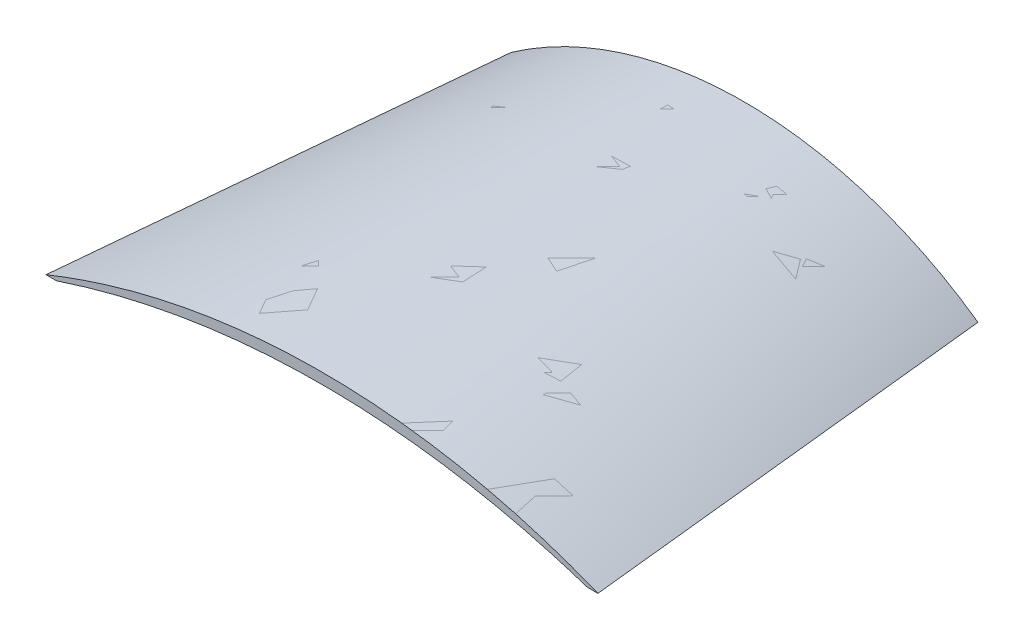
ISO-10303-21;
HEADER;
FILE_DESCRIPTION(('STEP AP214'),'2;1');
FILE_NAME('part.step','',(''),(''),'','','');
FILE_SCHEMA(('AUTOMOTIVE_DESIGN { 1 0 10303 214 1 1 1 1 }'));
ENDSEC;
DATA;
#1=APPLICATION_CONTEXT('core data for automotive mechanical design processes');
#2=APPLICATION_PROTOCOL_DEFINITION('international standard','automotive_design',2000,#1);
#3=PRODUCT_CONTEXT('',#1,'mechanical');
#4=PRODUCT('Part','Part','',(#3));
#5=PRODUCT_RELATED_PRODUCT_CATEGORY('part','',(#4));
#6=PRODUCT_DEFINITION_FORMATION('','',#4);
#7=PRODUCT_DEFINITION_CONTEXT('part definition',#1,'design');
#8=PRODUCT_DEFINITION('design','',#6,#7);
#9=PRODUCT_DEFINITION_SHAPE('','',#8);
#10=(LENGTH_UNIT() NAMED_UNIT(*) SI_UNIT(.MILLI.,.METRE.));
#11=(NAMED_UNIT(*) PLANE_ANGLE_UNIT() SI_UNIT($,.RADIAN.));
#12=(NAMED_UNIT(*) SI_UNIT($,.STERADIAN.) SOLID_ANGLE_UNIT());
#13=UNCERTAINTY_MEASURE_WITH_UNIT(LENGTH_MEASURE(1.E-05),#10,'distance_accuracy_value','');
#14=(GEOMETRIC_REPRESENTATION_CONTEXT(3) GLOBAL_UNCERTAINTY_ASSIGNED_CONTEXT((#13)) GLOBAL_UNIT_ASSIGNED_CONTEXT((#10,
#11,#12)) REPRESENTATION_CONTEXT('',''));
#15=CARTESIAN_POINT('',(0.,0.,0.));
#16=DIRECTION('',(0.,0.,1.));
#17=DIRECTION('',(1.,0.,0.));
#18=AXIS2_PLACEMENT_3D('',#15,#16,#17);
#19=CARTESIAN_POINT('',(48.689157452351,4.59007896781084,17.9937582420513));
#20=CARTESIAN_POINT('',(28.579999999884,13.7587850960682,17.9999999992136));
#21=CARTESIAN_POINT('',(48.5701563046397,4.59007896781084,17.9937582420513));
#22=CARTESIAN_POINT('',(28.579999999884,12.9331700401961,17.9999999992136));
#23=CARTESIAN_POINT('',(48.239008172471,4.59007896781085,17.9937582420513));
#24=CARTESIAN_POINT('',(28.579999999884,10.9313754692016,17.9999999992136));
#25=CARTESIAN_POINT('',(48.1202458578459,4.59007896781084,17.9937582420513));
#26=CARTESIAN_POINT('',(28.579999999884,8.48047323585448,17.9999999992136));
#27=CARTESIAN_POINT('',(47.210295202605,4.59007896781085,17.9937582420513));
#28=CARTESIAN_POINT('',(28.579999999884,6.87295938386817,17.9999999992136));
#29=CARTESIAN_POINT('',(47.5270718002623,4.59007896781085,17.9937582420513));
#30=CARTESIAN_POINT('',(28.579999999884,6.02886464909115,17.9999999992136));
#31=CARTESIAN_POINT('',(45.8512795127584,4.59788469502438,17.9940470368582));
#32=CARTESIAN_POINT('',(28.579999999884,5.27886464909115,17.9999999992136));
#33=CARTESIAN_POINT('',(43.9652838935692,4.6154547570032,17.9946970906608));
#34=CARTESIAN_POINT('',(28.579999999884,5.42063477681079,17.9999999992136));
#35=CARTESIAN_POINT('',(40.3735495091189,4.6489155959914,17.9959350684011));
#36=CARTESIAN_POINT('',(28.579999999884,5.01339566392776,17.9999999992136));
#37=CARTESIAN_POINT('',(34.8973977399996,4.69993179401957,17.9978225559673));
#38=CARTESIAN_POINT('',(28.579999999884,4.96024480418254,17.9999999992136));
#39=CARTESIAN_POINT('',(30.4247057116461,4.74159969364282,17.9993641769718));
#40=CARTESIAN_POINT('',(28.579999999884,4.81204284311955,17.9999999992136));
#41=CARTESIAN_POINT('',(28.579999999884,4.75878509606822,17.9999999992136));
#42=CARTESIAN_POINT('',(28.579999999884,4.75878509606822,17.9999999992136));
#43=B_SPLINE_SURFACE_WITH_KNOTS('',3,1,((#19,#20),(#21,#22),(#23,#24),(#25,#26),(#27,#28),(#29,
#30),(#31,#32),(#33,#34),(#35,#36),(#37,#38),(#39,#40),(#41,#42)),.UNSPECIFIED.,.F.,.F.,.F.,(4,
1,1,1,2,1,1,1,4),(2,2),(0.,0.125,0.25,0.375,0.5,0.625,0.75,0.875,1.),(0.,1.),.UNSPECIFIED.);
#44=CARTESIAN_POINT('',(48.689157452351,4.59007896781084,17.9937582420513));
#45=CARTESIAN_POINT('',(48.5701563046397,4.59007896781084,17.9937582420513));
#46=CARTESIAN_POINT('',(48.239008172471,4.59007896781085,17.9937582420513));
#47=CARTESIAN_POINT('',(48.1202458578459,4.59007896781084,17.9937582420513));
#48=CARTESIAN_POINT('',(47.210295202605,4.59007896781085,17.9937582420513));
#49=CARTESIAN_POINT('',(47.5270718002623,4.59007896781085,17.9937582420513));
#50=CARTESIAN_POINT('',(45.8512795127584,4.59788469502438,17.9940470368582));
#51=CARTESIAN_POINT('',(43.9652838935692,4.6154547570032,17.9946970906608));
#52=CARTESIAN_POINT('',(40.3735495091189,4.6489155959914,17.9959350684011));
#53=CARTESIAN_POINT('',(34.8973977399996,4.69993179401957,17.9978225559673));
#54=CARTESIAN_POINT('',(30.4247057116461,4.74159969364282,17.9993641769718));
#55=CARTESIAN_POINT('',(28.579999999884,4.75878509606822,17.9999999992136));
#56=B_SPLINE_CURVE_WITH_KNOTS('',3,(#44,#45,#46,#47,#48,#49,#50,#51,#52,#53,#54,#55),
.UNSPECIFIED.,.F.,.F.,(4,1,1,1,2,1,1,1,4),(0.,0.125,0.25,0.375,0.5,0.625,0.75,0.875,1.),.UNSPECIFIED.);
#57=CARTESIAN_POINT('',(48.689157452351,4.59007896781084,17.9937582420513));
#58=VERTEX_POINT('',#57);
#59=CARTESIAN_POINT('',(28.579999999884,4.75878509606822,17.9999999992136));
#60=VERTEX_POINT('',#59);
#61=EDGE_CURVE('E14',#58,#60,#56,.T.);
#62=DIRECTION('',(0.,1.,0.));
#63=VECTOR('',#62,1.);
#64=CARTESIAN_POINT('',(28.579999999884,5.65386464909115,17.9999999992136));
#65=LINE('',#64,#63);
#66=CARTESIAN_POINT('',(28.579999999884,13.7587850960682,17.9999999992136));
#67=VERTEX_POINT('',#66);
#68=EDGE_CURVE('E153',#60,#67,#65,.T.);
#69=DIRECTION('',(0.909885493207906,-0.414859385198377,-0.000282422787108244));
#70=VECTOR('',#69,1.);
#71=CARTESIAN_POINT('',(38.6345787261175,9.17443203193953,17.9968791206325));
#72=LINE('',#71,#70);
#73=EDGE_CURVE('E148',#67,#58,#72,.T.);
#74=ORIENTED_EDGE('',*,*,#61,.T.);
#75=ORIENTED_EDGE('',*,*,#68,.T.);
#76=ORIENTED_EDGE('',*,*,#73,.T.);
#77=EDGE_LOOP('',(#74,#75,#76));
#78=FACE_BOUND('',#77,.T.);
#79=ADVANCED_FACE('F145',(#78),#43,.T.);
#80=OPEN_SHELL('',(#79));
#81=SHELL_BASED_SURFACE_MODEL('B2',(#80));
#82=CARTESIAN_POINT('',(44.752828689061,3.97,4.86883118313408));
#83=CARTESIAN_POINT('',(45.3982716101576,4.17669298927028,9.24380686943982));
#84=CARTESIAN_POINT('',(46.0437145312543,4.38338597854056,13.6187825557456));
#85=CARTESIAN_POINT('',(46.689157452351,4.59007896781085,17.9937582420513));
#86=CARTESIAN_POINT('',(39.3618953557276,3.97,4.86883118313408));
#87=CARTESIAN_POINT('',(39.7921874487724,4.19543811463221,9.24450039801341));
#88=CARTESIAN_POINT('',(40.2224795418172,4.42087622926443,13.6201696128927));
#89=CARTESIAN_POINT('',(40.652771634862,4.64631434389664,17.9958388277721));
#90=CARTESIAN_POINT('',(33.9709620223943,3.97,4.86883118313408));
#91=CARTESIAN_POINT('',(34.1861032873872,4.21418323999414,9.245193926587));
#92=CARTESIAN_POINT('',(34.4012445523801,4.45836647998829,13.6215566700399));
#93=CARTESIAN_POINT('',(34.616385817373,4.70254971998243,17.9979194134928));
#94=CARTESIAN_POINT('',(28.580028689061,3.97,4.86883118313408));
#95=CARTESIAN_POINT('',(28.580019126002,4.23292836535607,9.24588745516059));
#96=CARTESIAN_POINT('',(28.580009562943,4.49585673071215,13.6229437271871));
#97=CARTESIAN_POINT('',(28.579999999884,4.75878509606822,17.9999999992136));
#98=B_SPLINE_SURFACE_WITH_KNOTS('',3,3,((#82,#83,#84,#85),(#86,#87,#88,#89),(#90,#91,#92,#93),
(#94,#95,#96,#97)),.UNSPECIFIED.,.F.,.F.,.F.,(4,4),(4,4),(0.,1.),(0.,1.),.UNSPECIFIED.);
#99=DIRECTION('',(-1.,0.,0.));
#100=VECTOR('',#99,1.);
#101=CARTESIAN_POINT('',(36.666428689061,3.97,4.86883118313408));
#102=LINE('',#101,#100);
#103=CARTESIAN_POINT('',(44.752828689061,3.97,4.86883118313408));
#104=VERTEX_POINT('',#103);
#105=CARTESIAN_POINT('',(28.580028689061,3.97,4.86883118313408));
#106=VERTEX_POINT('',#105);
#107=EDGE_CURVE('E143',#104,#106,#102,.T.);
#108=DIRECTION('',(-2.18088401127808E-06,0.0599615947437545,0.998200684807935));
#109=VECTOR('',#108,1.);
#110=CARTESIAN_POINT('',(28.5800143444725,4.36439254803411,11.4344155911738));
#111=LINE('',#110,#109);
#112=CARTESIAN_POINT('',(28.579999999884,4.75878509606822,17.9999999992136));
#113=VERTEX_POINT('',#112);
#114=EDGE_CURVE('E211',#106,#113,#111,.T.);
#115=DIRECTION('',(0.999956548877762,-0.00931566243374799,-0.000344659102298652));
#116=VECTOR('',#115,1.);
#117=CARTESIAN_POINT('',(37.6345787261175,4.67443203193953,17.9968791206324));
#118=LINE('',#117,#116);
#119=CARTESIAN_POINT('',(46.689157452351,4.59007896781085,17.9937582420513));
#120=VERTEX_POINT('',#119);
#121=EDGE_CURVE('E219',#113,#120,#118,.T.);
#122=DIRECTION('',(-0.145791696182336,-0.0466875079263572,-0.988213063022294));
#123=VECTOR('',#122,1.);
#124=CARTESIAN_POINT('',(45.720993070706,4.28003948390542,11.4312947125927));
#125=LINE('',#124,#123);
#126=EDGE_CURVE('E205',#120,#104,#125,.T.);
#127=ORIENTED_EDGE('',*,*,#107,.T.);
#128=ORIENTED_EDGE('',*,*,#114,.T.);
#129=ORIENTED_EDGE('',*,*,#121,.T.);
#130=ORIENTED_EDGE('',*,*,#126,.T.);
#131=EDGE_LOOP('',(#127,#128,#129,#130));
#132=FACE_BOUND('',#131,.T.);
#133=ADVANCED_FACE('F202',(#132),#98,.T.);
#134=OPEN_SHELL('',(#133));
#135=SHELL_BASED_SURFACE_MODEL('B8',(#134));
#136=CARTESIAN_POINT('',(28.580028689061,12.97,4.86883118313408));
#137=DIRECTION('',(0.,0.,1.));
#138=DIRECTION('',(0.,-1.,0.));
#139=AXIS2_PLACEMENT_3D('',#136,#137,#138);
#140=PLANE('',#139);
#141=DIRECTION('',(0.,-1.,0.));
#142=VECTOR('',#141,1.);
#143=CARTESIAN_POINT('',(28.580028689061,4.96049128367671,4.86883118313408));
#144=LINE('',#143,#142);
#145=CARTESIAN_POINT('',(28.580028689061,12.97,4.86883118313408));
#146=VERTEX_POINT('',#145);
#147=CARTESIAN_POINT('',(28.580028689061,3.97,4.86883118313408));
#148=VERTEX_POINT('',#147);
#149=EDGE_CURVE('E200',#146,#148,#144,.T.);
#150=ORIENTED_EDGE('',*,*,#149,.T.);
#151=DIRECTION('',(1.,0.,0.));
#152=VECTOR('',#151,1.);
#153=CARTESIAN_POINT('',(44.752828689061,3.97,4.86883118313408));
#154=LINE('',#153,#152);
#155=CARTESIAN_POINT('',(46.752828689061,3.97,4.86883118313408));
#156=VERTEX_POINT('',#155);
#157=EDGE_CURVE('E269',#148,#156,#154,.T.);
#158=ORIENTED_EDGE('',*,*,#157,.T.);
#159=DIRECTION('',(-0.896124896259063,0.443801949415146,0.));
#160=VECTOR('',#159,1.);
#161=CARTESIAN_POINT('',(37.666428689061,8.47,4.86883118313408));
#162=LINE('',#161,#160);
#163=EDGE_CURVE('E264',#156,#146,#162,.T.);
#164=ORIENTED_EDGE('',*,*,#163,.T.);
#165=EDGE_LOOP('',(#150,#158,#164));
#166=FACE_BOUND('',#165,.T.);
#167=ADVANCED_FACE('F263',(#166),#140,.T.);
#168=OPEN_SHELL('',(#167));
#169=SHELL_BASED_SURFACE_MODEL('B137',(#168));
#170=CARTESIAN_POINT('',(-42.8625,7.93999999999995,88.9));
#171=CARTESIAN_POINT('',(-41.6740571036464,6.61666666666663,60.889610394378));
#172=CARTESIAN_POINT('',(-40.4856142072927,5.29333333333331,32.8792207887561));
#173=CARTESIAN_POINT('',(-39.297171310939,3.96999999999999,4.86883118313408));
#174=CARTESIAN_POINT('',(-10.4009854008597,18.741233173061,88.9));
#175=CARTESIAN_POINT('',(-11.4515463975695,19.1306543842067,60.889610394378));
#176=CARTESIAN_POINT('',(-12.5021073942794,19.5200755953524,32.8792207887561));
#177=CARTESIAN_POINT('',(-13.5526683909892,19.9094968064982,4.86883118313408));
#178=CARTESIAN_POINT('',(24.6884854008597,18.7412331730609,88.9));
#179=CARTESIAN_POINT('',(22.7950988569435,19.1306543842067,60.889610394378));
#180=CARTESIAN_POINT('',(20.9017123130273,19.5200755953524,32.8792207887561));
#181=CARTESIAN_POINT('',(19.0083257691111,19.9094968064982,4.86883118313408));
#182=CARTESIAN_POINT('',(57.15,7.93999999999995,88.9));
#183=CARTESIAN_POINT('',(53.0176095630203,6.61666666666663,60.889610394378));
#184=CARTESIAN_POINT('',(48.8852191260406,5.29333333333332,32.8792207887561));
#185=CARTESIAN_POINT('',(44.752828689061,3.97,4.86883118313408));
#186=B_SPLINE_SURFACE_WITH_KNOTS('',3,3,((#170,#171,#172,#173),(#174,#175,#176,#177),(#178,#179,
#180,#181),(#182,#183,#184,#185)),.UNSPECIFIED.,.F.,.F.,.F.,(4,4),(4,4),(0.,1.),(0.,1.),.UNSPECIFIED.);
#187=CARTESIAN_POINT('',(-39.297171310939,3.96999999999999,4.86883118313408));
#188=CARTESIAN_POINT('',(-13.5526683909892,19.9094968064982,4.86883118313408));
#189=CARTESIAN_POINT('',(19.0083257691111,19.9094968064982,4.86883118313408));
#190=CARTESIAN_POINT('',(44.752828689061,3.97,4.86883118313408));
#191=B_SPLINE_CURVE_WITH_KNOTS('',3,(#187,#188,#189,#190),.UNSPECIFIED.,.F.,.F.,(4,4),(0.,1.),.UNSPECIFIED.);
#192=CARTESIAN_POINT('',(28.580028689061,11.6268427057406,4.86883118313408));
#193=VERTEX_POINT('',#192);
#194=CARTESIAN_POINT('',(-39.297171310939,3.96999999999999,4.86883118313407));
#195=VERTEX_POINT('',#194);
#196=EDGE_CURVE('E445',#193,#195,#191,.F.);
#197=CARTESIAN_POINT('',(28.5800286893953,11.6268409681702,4.86883118313408));
#198=CARTESIAN_POINT('',(28.5800270956384,11.6660128907247,5.59820301042193));
#199=CARTESIAN_POINT('',(28.5800255019518,11.7047064339545,6.32760049366624));
#200=CARTESIAN_POINT('',(28.5800223145882,11.7811621084876,7.78644208976796));
#201=CARTESIAN_POINT('',(28.5800207209112,11.8189242425791,8.51588620247924));
#202=CARTESIAN_POINT('',(28.5800175334283,11.8935426272735,9.97481971543914));
#203=CARTESIAN_POINT('',(28.5800159396225,11.9303988791516,10.7043091156226));
#204=CARTESIAN_POINT('',(28.5800127519229,12.0032298819512,12.1633318330936));
#205=CARTESIAN_POINT('',(28.5800111580291,12.0392046329665,12.8928651503765));
#206=CARTESIAN_POINT('',(28.5800079701458,12.1102963107678,14.3519746748296));
#207=CARTESIAN_POINT('',(28.5800063761563,12.1454132362548,15.0815508820632));
#208=CARTESIAN_POINT('',(28.5800031880859,12.2148119100497,16.5407451134762));
#209=CARTESIAN_POINT('',(28.580001594005,12.2490936559679,17.2703631377694));
#210=CARTESIAN_POINT('',(28.579999999884,12.2829690634713,17.9999999992136));
#211=B_SPLINE_CURVE_WITH_KNOTS('',3,(#197,#198,#199,#200,#201,#202,#203,#204,#205,#206,#207,
#208,#209,#210),.UNSPECIFIED.,.F.,.F.,(4,2,2,2,2,2,4),(0.,2.19126867317075,4.38253078619014,
6.57378981434242,8.76504860948881,10.9563107224803,13.1475791041849),.UNSPECIFIED.);
#212=CARTESIAN_POINT('',(28.579999999884,12.2829690634711,17.9999999992136));
#213=VERTEX_POINT('',#212);
#214=EDGE_CURVE('E375',#193,#213,#211,.T.);
#215=CARTESIAN_POINT('',(46.6822244811791,4.59401431014356,17.9939038410965));
#216=CARTESIAN_POINT('',(46.6571709124805,4.60817179956383,17.9939545726191));
#217=CARTESIAN_POINT('',(46.6321092457771,4.62231498842695,17.9939854970374));
#218=CARTESIAN_POINT('',(46.5819708916961,4.65057474726141,17.994027965165));
#219=CARTESIAN_POINT('',(46.5568942043196,4.6646913172345,17.9940395088756));
#220=CARTESIAN_POINT('',(46.5067269823571,4.69289982157197,17.994063449088));
#221=CARTESIAN_POINT('',(46.481636447772,4.70699175593775,17.9940758455898));
#222=CARTESIAN_POINT('',(46.4063444626374,4.74923126147753,17.9941212014392));
#223=CARTESIAN_POINT('',(46.3561226487804,4.77734252490979,17.9941623271277));
#224=CARTESIAN_POINT('',(46.2053733026551,4.8615265980085,17.9942730313863));
#225=CARTESIAN_POINT('',(46.1047620141055,4.91744960690058,17.9943299369904));
#226=CARTESIAN_POINT('',(45.8025968981649,5.0846217449798,17.9944833698651));
#227=CARTESIAN_POINT('',(45.6007129939353,5.19527332418752,17.9945626123297));
#228=CARTESIAN_POINT('',(44.5890192221625,5.74459878841608,17.99494560341));
#229=CARTESIAN_POINT('',(43.7726683397924,6.17131854147054,17.9952095711205));
#230=CARTESIAN_POINT('',(42.1265485467287,6.99895949910857,17.9957423994921));
#231=CARTESIAN_POINT('',(41.2967737608107,7.39986900293337,17.9960112623023));
#232=CARTESIAN_POINT('',(39.6249289963167,8.1753162284503,17.9965442113562));
#233=CARTESIAN_POINT('',(38.7828578251754,8.54985137143733,17.996808297131));
#234=CARTESIAN_POINT('',(36.4097159032285,9.5607898179072,17.9975513506076));
#235=CARTESIAN_POINT('',(34.8657378362858,10.1673097290751,17.9980334086904));
#236=CARTESIAN_POINT('',(32.5258635339775,11.0106916448606,17.9987644773667));
#237=CARTESIAN_POINT('',(31.7417547688361,11.2808020597391,17.9990095491613));
#238=CARTESIAN_POINT('',(30.1662329453497,11.7986766005359,17.9995025592739));
#239=CARTESIAN_POINT('',(29.3748202324503,12.0464417773782,17.9997504974565));
#240=CARTESIAN_POINT('',(28.579999999884,12.2829690634713,17.9999999992136));
#241=B_SPLINE_CURVE_WITH_KNOTS('',3,(#215,#216,#217,#218,#219,#220,#221,#222,#223,#224,#225,
#226,#227,#228,#229,#230,#231,#232,#233,#234,#235,#236,#237,#238,#239,#240),.UNSPECIFIED.,.F.,
.F.,(4,2,2,2,2,2,2,2,2,2,2,2,4),(0.,0.0863311001361579,0.172662194599267,0.258993284168146,
0.431655525536669,0.776980518886785,1.46763454645137,4.23057309572656,6.99475549510256,
9.75920778320707,14.7325596240254,17.2202740734964,19.7078714616109),.UNSPECIFIED.);
#242=CARTESIAN_POINT('',(46.6849549506093,4.59241980439428,17.9935058812316));
#243=VERTEX_POINT('',#242);
#244=EDGE_CURVE('E559',#243,#213,#241,.T.);
#245=DIRECTION('',(-0.145791696182337,-0.0466875079263568,-0.988213063022294));
#246=VECTOR('',#245,1.);
#247=CARTESIAN_POINT('',(50.9514143445305,5.95499999999997,46.884415591567));
#248=LINE('',#247,#246);
#249=CARTESIAN_POINT('',(57.15,7.93999999999995,88.9));
#250=VERTEX_POINT('',#249);
#251=EDGE_CURVE('E323',#250,#243,#248,.T.);
#252=CARTESIAN_POINT('',(-42.8625,7.93999999999995,88.9));
#253=CARTESIAN_POINT('',(-10.4009854008597,18.741233173061,88.9));
#254=CARTESIAN_POINT('',(24.6884854008597,18.7412331730609,88.9));
#255=CARTESIAN_POINT('',(57.15,7.93999999999995,88.9));
#256=B_SPLINE_CURVE_WITH_KNOTS('',3,(#252,#253,#254,#255),.UNSPECIFIED.,.F.,.F.,(4,4),(0.,1.),.UNSPECIFIED.);
#257=CARTESIAN_POINT('',(-42.8625,7.93999999999995,88.9));
#258=VERTEX_POINT('',#257);
#259=EDGE_CURVE('E261',#258,#250,#256,.T.);
#260=DIRECTION('',(-0.0423433626827023,0.0471494116001407,0.997989966193289));
#261=VECTOR('',#260,1.);
#262=CARTESIAN_POINT('',(-41.0798356554695,5.95499999999997,46.884415591567));
#263=LINE('',#262,#261);
#264=EDGE_CURVE('E469',#195,#258,#263,.T.);
#265=ORIENTED_EDGE('',*,*,#196,.F.);
#266=ORIENTED_EDGE('',*,*,#214,.T.);
#267=ORIENTED_EDGE('',*,*,#244,.F.);
#268=ORIENTED_EDGE('',*,*,#251,.F.);
#269=ORIENTED_EDGE('',*,*,#259,.F.);
#270=ORIENTED_EDGE('',*,*,#264,.F.);
#271=EDGE_LOOP('',(#265,#266,#267,#268,#269,#270));
#272=FACE_BOUND('',#271,.T.);
#273=ADVANCED_FACE('F308',(#272),#186,.F.);
#274=CARTESIAN_POINT('',(44.752778689061,3.97,4.86883118313408));
#275=VERTEX_POINT('',#274);
#276=EDGE_CURVE('E478',#243,#275,#248,.T.);
#277=CARTESIAN_POINT('',(46.6794803120017,4.59557174062405,17.9939614626124));
#278=CARTESIAN_POINT('',(46.518852145451,4.54351508112422,16.9001278956015));
#279=CARTESIAN_POINT('',(46.3582372280802,4.49144163738851,15.8062931814032));
#280=CARTESIAN_POINT('',(46.0370374170481,4.38725708898678,13.6186211383773));
#281=CARTESIAN_POINT('',(45.8764525233867,4.33514598432076,12.5247838095495));
#282=CARTESIAN_POINT('',(45.3947940550932,4.17876493914842,9.24358003123785));
#283=CARTESIAN_POINT('',(45.0737707848977,4.07443239243007,7.05620918125996));
#284=CARTESIAN_POINT('',(44.752828689061,3.97,4.86883118313408));
#285=B_SPLINE_CURVE_WITH_KNOTS('',3,(#277,#278,#279,#280,#281,#282,#283,#284),.UNSPECIFIED.,.F.,
.F.,(4,2,2,4),(0.,3.32036874251819,6.64073748519368,13.2805260358254),.UNSPECIFIED.);
#286=EDGE_CURVE('E525',#243,#275,#285,.T.);
#287=ORIENTED_EDGE('',*,*,#276,.F.);
#288=ORIENTED_EDGE('',*,*,#286,.T.);
#289=EDGE_LOOP('',(#287,#288));
#290=FACE_BOUND('',#289,.T.);
#291=ADVANCED_FACE('F310',(#290),#186,.F.);
#292=CARTESIAN_POINT('',(59.15,7.94,88.9));
#293=CARTESIAN_POINT('',(55.0176095630203,6.61666666666667,60.889610394378));
#294=CARTESIAN_POINT('',(50.8852191260406,5.29333333333333,32.8792207887561));
#295=CARTESIAN_POINT('',(46.752828689061,3.96999999999999,4.86883118313408));
#296=CARTESIAN_POINT('',(25.7941027292695,21.4384960232862,88.9));
#297=CARTESIAN_POINT('',(23.9827338237172,21.8179751858315,60.889610394378));
#298=CARTESIAN_POINT('',(22.171364918165,22.1974543483768,32.8792207887561));
#299=CARTESIAN_POINT('',(20.3599960126127,22.5769335109221,4.86883118313408));
#300=CARTESIAN_POINT('',(-11.5066027292695,21.4384960232862,88.9));
#301=CARTESIAN_POINT('',(-12.6391813643432,21.8179751858315,60.889610394378));
#302=CARTESIAN_POINT('',(-13.771759999417,22.1974543483768,32.8792207887561));
#303=CARTESIAN_POINT('',(-14.9043386344908,22.5769335109221,4.86883118313408));
#304=CARTESIAN_POINT('',(-44.8625,7.94,88.9));
#305=CARTESIAN_POINT('',(-43.6740571036463,6.61666666666667,60.889610394378));
#306=CARTESIAN_POINT('',(-42.4856142072927,5.29333333333333,32.8792207887561));
#307=CARTESIAN_POINT('',(-41.297171310939,3.96999999999999,4.86883118313408));
#308=B_SPLINE_SURFACE_WITH_KNOTS('',3,3,((#292,#293,#294,#295),(#296,#297,#298,#299),(#300,#301,
#302,#303),(#304,#305,#306,#307)),.UNSPECIFIED.,.F.,.F.,.F.,(4,4),(4,4),(0.,1.),(0.,1.),.UNSPECIFIED.);
#309=CARTESIAN_POINT('',(59.15,7.94,88.9));
#310=CARTESIAN_POINT('',(25.7941027292695,21.4384960232862,88.9));
#311=CARTESIAN_POINT('',(-11.5066027292695,21.4384960232862,88.9));
#312=CARTESIAN_POINT('',(-44.8625,7.94,88.9));
#313=B_SPLINE_CURVE_WITH_KNOTS('',3,(#309,#310,#311,#312),.UNSPECIFIED.,.F.,.F.,(4,4),(0.,1.),.UNSPECIFIED.);
#314=CARTESIAN_POINT('',(59.15,7.94,88.9));
#315=VERTEX_POINT('',#314);
#316=CARTESIAN_POINT('',(-44.8625,7.94,88.9));
#317=VERTEX_POINT('',#316);
#318=EDGE_CURVE('E658',#315,#317,#313,.T.);
#319=DIRECTION('',(0.145791696182337,0.0466875079263575,0.988213063022294));
#320=VECTOR('',#319,1.);
#321=CARTESIAN_POINT('',(52.9514143445305,5.955,46.884415591567));
#322=LINE('',#321,#320);
#323=CARTESIAN_POINT('',(46.752828689061,3.96999999999999,4.86883118313408));
#324=VERTEX_POINT('',#323);
#325=EDGE_CURVE('E527',#324,#315,#322,.T.);
#326=CARTESIAN_POINT('',(46.752828689061,3.96999999999999,4.86883118313408));
#327=CARTESIAN_POINT('',(20.3599960126127,22.5769335109221,4.86883118313408));
#328=CARTESIAN_POINT('',(-14.9043386344908,22.5769335109221,4.86883118313408));
#329=CARTESIAN_POINT('',(-41.297171310939,3.96999999999999,4.86883118313408));
#330=B_SPLINE_CURVE_WITH_KNOTS('',3,(#326,#327,#328,#329),.UNSPECIFIED.,.F.,.F.,(4,4),(0.,1.),.UNSPECIFIED.);
#331=CARTESIAN_POINT('',(-41.297171310939,3.96999999999999,4.86883118313406));
#332=VERTEX_POINT('',#331);
#333=EDGE_CURVE('E454',#332,#324,#330,.F.);
#334=DIRECTION('',(0.0423433626827023,-0.0471494116001413,-0.997989966193289));
#335=VECTOR('',#334,1.);
#336=CARTESIAN_POINT('',(-43.0798356554695,5.955,46.884415591567));
#337=LINE('',#336,#335);
#338=EDGE_CURVE('E663',#317,#332,#337,.T.);
#339=ORIENTED_EDGE('',*,*,#318,.F.);
#340=ORIENTED_EDGE('',*,*,#325,.F.);
#341=ORIENTED_EDGE('',*,*,#333,.F.);
#342=ORIENTED_EDGE('',*,*,#338,.F.);
#343=EDGE_LOOP('',(#339,#340,#341,#342));
#344=FACE_BOUND('',#343,.T.);
#345=ADVANCED_FACE('F575',(#344),#308,.F.);
#346=CARTESIAN_POINT('',(7.14374999999998,16.0409248797957,88.9));
#347=DIRECTION('',(0.,0.,1.));
#348=DIRECTION('',(1.,0.,0.));
#349=AXIS2_PLACEMENT_3D('',#346,#347,#348);
#350=PLANE('',#349);
#351=DIRECTION('',(1.,0.,0.));
#352=VECTOR('',#351,1.);
#353=CARTESIAN_POINT('',(-44.8625,7.94,88.9));
#354=LINE('',#353,#352);
#355=EDGE_CURVE('E653',#317,#258,#354,.T.);
#356=ORIENTED_EDGE('',*,*,#355,.T.);
#357=ORIENTED_EDGE('',*,*,#259,.T.);
#358=DIRECTION('',(-1.,0.,0.));
#359=VECTOR('',#358,1.);
#360=CARTESIAN_POINT('',(59.15,7.94,88.9));
#361=LINE('',#360,#359);
#362=EDGE_CURVE('E330',#315,#250,#361,.T.);
#363=ORIENTED_EDGE('',*,*,#362,.F.);
#364=ORIENTED_EDGE('',*,*,#318,.T.);
#365=EDGE_LOOP('',(#356,#357,#363,#364));
#366=FACE_BOUND('',#365,.T.);
#367=ADVANCED_FACE('F632',(#366),#350,.T.);
#368=CARTESIAN_POINT('',(-1.03573981824243E-13,3.73164596759147,-0.176299279183217));
#369=DIRECTION('',(0.,-0.998885849311809,0.0471917370375973));
#370=DIRECTION('',(0.,-0.0471917370375974,-0.998885849311809));
#371=AXIS2_PLACEMENT_3D('',#368,#369,#370);
#372=PLANE('',#371);
#373=ORIENTED_EDGE('',*,*,#325,.T.);
#374=ORIENTED_EDGE('',*,*,#362,.T.);
#375=ORIENTED_EDGE('',*,*,#251,.T.);
#376=ORIENTED_EDGE('',*,*,#276,.T.);
#377=DIRECTION('',(-1.,0.,0.));
#378=VECTOR('',#377,1.);
#379=CARTESIAN_POINT('',(46.752828689061,3.96999999999999,4.86883118313408));
#380=LINE('',#379,#378);
#381=EDGE_CURVE('E399',#324,#275,#380,.T.);
#382=ORIENTED_EDGE('',*,*,#381,.F.);
#383=EDGE_LOOP('',(#373,#374,#375,#376,#382));
#384=FACE_BOUND('',#383,.T.);
#385=ADVANCED_FACE('F626',(#384),#372,.T.);
#386=CARTESIAN_POINT('',(0.,3.73164596759256,-0.176299279183284));
#387=DIRECTION('',(0.,-0.998885849311809,0.0471917370376015));
#388=DIRECTION('',(0.,-0.0471917370376015,-0.998885849311809));
#389=AXIS2_PLACEMENT_3D('',#386,#387,#388);
#390=PLANE('',#389);
#391=DIRECTION('',(1.,0.,0.));
#392=VECTOR('',#391,1.);
#393=CARTESIAN_POINT('',(-41.297171310939,3.96999999999999,4.86883118313407));
#394=LINE('',#393,#392);
#395=EDGE_CURVE('E479',#332,#195,#394,.T.);
#396=ORIENTED_EDGE('',*,*,#395,.T.);
#397=ORIENTED_EDGE('',*,*,#264,.T.);
#398=ORIENTED_EDGE('',*,*,#355,.F.);
#399=ORIENTED_EDGE('',*,*,#338,.T.);
#400=EDGE_LOOP('',(#396,#397,#398,#399));
#401=FACE_BOUND('',#400,.T.);
#402=ADVANCED_FACE('F415',(#401),#390,.T.);
#403=CARTESIAN_POINT('',(2.72782868906096,15.9246226048736,4.86883118313408));
#404=DIRECTION('',(0.,0.,1.));
#405=DIRECTION('',(1.,0.,0.));
#406=AXIS2_PLACEMENT_3D('',#403,#404,#405);
#407=PLANE('',#406);
#408=ORIENTED_EDGE('',*,*,#381,.T.);
#409=DIRECTION('',(1.,0.,0.));
#410=VECTOR('',#409,1.);
#411=CARTESIAN_POINT('',(44.752828689061,3.97,4.86883118313408));
#412=LINE('',#411,#410);
#413=CARTESIAN_POINT('',(28.580028689061,3.97,4.86883118313408));
#414=VERTEX_POINT('',#413);
#415=EDGE_CURVE('E381',#414,#275,#412,.T.);
#416=ORIENTED_EDGE('',*,*,#415,.F.);
#417=DIRECTION('',(0.,-1.,0.));
#418=VECTOR('',#417,1.);
#419=CARTESIAN_POINT('',(28.580028689061,4.96049128367671,4.86883118313408));
#420=LINE('',#419,#418);
#421=EDGE_CURVE('E367',#193,#414,#420,.T.);
#422=ORIENTED_EDGE('',*,*,#421,.F.);
#423=ORIENTED_EDGE('',*,*,#196,.T.);
#424=ORIENTED_EDGE('',*,*,#395,.F.);
#425=ORIENTED_EDGE('',*,*,#333,.T.);
#426=EDGE_LOOP('',(#408,#416,#422,#423,#424,#425));
#427=FACE_BOUND('',#426,.T.);
#428=ADVANCED_FACE('F397',(#427),#407,.F.);
#429=CARTESIAN_POINT('',(48.689157452351,4.59007896781084,17.9937582420513));
#430=CARTESIAN_POINT('',(28.579999999884,13.7587850960682,17.9999999992136));
#431=CARTESIAN_POINT('',(48.5701563046397,4.59007896781084,17.9937582420513));
#432=CARTESIAN_POINT('',(28.579999999884,12.9331700401961,17.9999999992136));
#433=CARTESIAN_POINT('',(48.239008172471,4.59007896781085,17.9937582420513));
#434=CARTESIAN_POINT('',(28.579999999884,10.9313754692016,17.9999999992136));
#435=CARTESIAN_POINT('',(48.1202458578459,4.59007896781084,17.9937582420513));
#436=CARTESIAN_POINT('',(28.579999999884,8.48047323585448,17.9999999992136));
#437=CARTESIAN_POINT('',(47.210295202605,4.59007896781085,17.9937582420513));
#438=CARTESIAN_POINT('',(28.579999999884,6.87295938386817,17.9999999992136));
#439=CARTESIAN_POINT('',(47.5270718002623,4.59007896781085,17.9937582420513));
#440=CARTESIAN_POINT('',(28.579999999884,6.02886464909115,17.9999999992136));
#441=CARTESIAN_POINT('',(45.8512795127584,4.59788469502438,17.9940470368582));
#442=CARTESIAN_POINT('',(28.579999999884,5.27886464909115,17.9999999992136));
#443=CARTESIAN_POINT('',(43.9652838935692,4.6154547570032,17.9946970906608));
#444=CARTESIAN_POINT('',(28.579999999884,5.42063477681079,17.9999999992136));
#445=CARTESIAN_POINT('',(40.3735495091189,4.6489155959914,17.9959350684011));
#446=CARTESIAN_POINT('',(28.579999999884,5.01339566392776,17.9999999992136));
#447=CARTESIAN_POINT('',(34.8973977399996,4.69993179401957,17.9978225559673));
#448=CARTESIAN_POINT('',(28.579999999884,4.96024480418254,17.9999999992136));
#449=CARTESIAN_POINT('',(30.4247057116461,4.74159969364282,17.9993641769718));
#450=CARTESIAN_POINT('',(28.579999999884,4.81204284311955,17.9999999992136));
#451=CARTESIAN_POINT('',(28.579999999884,4.75878509606822,17.9999999992136));
#452=CARTESIAN_POINT('',(28.579999999884,4.75878509606822,17.9999999992136));
#453=B_SPLINE_SURFACE_WITH_KNOTS('',3,1,((#429,#430),(#431,#432),(#433,#434),(#435,#436),(#437,
#438),(#439,#440),(#441,#442),(#443,#444),(#445,#446),(#447,#448),(#449,#450),(#451,#452)),
.UNSPECIFIED.,.F.,.F.,.F.,(4,1,1,1,2,1,1,1,4),(2,2),(0.,0.125,0.25,0.375,0.5,0.625,0.75,0.875,
1.),(0.,1.),.UNSPECIFIED.);
#454=CARTESIAN_POINT('',(48.689157452351,4.59007896781084,17.9937582420513));
#455=CARTESIAN_POINT('',(48.5701563046397,4.59007896781084,17.9937582420513));
#456=CARTESIAN_POINT('',(48.239008172471,4.59007896781085,17.9937582420513));
#457=CARTESIAN_POINT('',(48.1202458578459,4.59007896781084,17.9937582420513));
#458=CARTESIAN_POINT('',(47.210295202605,4.59007896781085,17.9937582420513));
#459=CARTESIAN_POINT('',(47.5270718002623,4.59007896781085,17.9937582420513));
#460=CARTESIAN_POINT('',(45.8512795127584,4.59788469502438,17.9940470368582));
#461=CARTESIAN_POINT('',(43.9652838935692,4.6154547570032,17.9946970906608));
#462=CARTESIAN_POINT('',(40.3735495091189,4.6489155959914,17.9959350684011));
#463=CARTESIAN_POINT('',(34.8973977399996,4.69993179401957,17.9978225559673));
#464=CARTESIAN_POINT('',(30.4247057116461,4.74159969364282,17.9993641769718));
#465=CARTESIAN_POINT('',(28.579999999884,4.75878509606822,17.9999999992136));
#466=B_SPLINE_CURVE_WITH_KNOTS('',3,(#454,#455,#456,#457,#458,#459,#460,#461,#462,#463,#464,
#465),.UNSPECIFIED.,.F.,.F.,(4,1,1,1,2,1,1,1,4),(0.,0.125,0.25,0.375,0.5,0.625,0.75,0.875,1.),.UNSPECIFIED.);
#467=CARTESIAN_POINT('',(28.579999999884,4.75878509606822,17.9999999992136));
#468=VERTEX_POINT('',#467);
#469=EDGE_CURVE('E391',#243,#468,#466,.T.);
#470=DIRECTION('',(0.,1.,0.));
#471=VECTOR('',#470,1.);
#472=CARTESIAN_POINT('',(28.579999999884,5.65386464909115,17.9999999992136));
#473=LINE('',#472,#471);
#474=EDGE_CURVE('E394',#468,#213,#473,.T.);
#475=ORIENTED_EDGE('',*,*,#469,.F.);
#476=ORIENTED_EDGE('',*,*,#244,.T.);
#477=ORIENTED_EDGE('',*,*,#474,.F.);
#478=EDGE_LOOP('',(#475,#476,#477));
#479=FACE_BOUND('',#478,.T.);
#480=ADVANCED_FACE('F414',(#479),#453,.F.);
#481=CARTESIAN_POINT('',(28.5800393264208,0.,6.24421038196417E-05));
#482=DIRECTION('',(-0.999999999997613,0.,-2.18481518189403E-06));
#483=DIRECTION('',(-2.18481518189403E-06,0.,0.999999999997613));
#484=AXIS2_PLACEMENT_3D('',#481,#482,#483);
#485=PLANE('',#484);
#486=ORIENTED_EDGE('',*,*,#214,.F.);
#487=ORIENTED_EDGE('',*,*,#421,.T.);
#488=DIRECTION('',(-2.1808840107506E-06,0.0599615947437546,0.998200684807935));
#489=VECTOR('',#488,1.);
#490=CARTESIAN_POINT('',(28.580028689061,3.97,4.86883118313408));
#491=LINE('',#490,#489);
#492=EDGE_CURVE('E372',#414,#468,#491,.T.);
#493=ORIENTED_EDGE('',*,*,#492,.T.);
#494=ORIENTED_EDGE('',*,*,#474,.T.);
#495=EDGE_LOOP('',(#486,#487,#493,#494));
#496=FACE_BOUND('',#495,.T.);
#497=ADVANCED_FACE('F370',(#496),#485,.T.);
#498=CARTESIAN_POINT('',(28.580028689061,3.97,4.86883118313408));
#499=CARTESIAN_POINT('',(28.579999999884,4.75878509606822,17.9999999992136));
#500=CARTESIAN_POINT('',(31.608828689061,3.97,4.86883118313408));
#501=CARTESIAN_POINT('',(31.9315083238911,4.72756221920883,17.9988448211695));
#502=CARTESIAN_POINT('',(34.637628689061,3.97,4.86883118313408));
#503=CARTESIAN_POINT('',(35.2829923833861,4.69347341862516,17.997583610226));
#504=CARTESIAN_POINT('',(39.2517891334091,3.97,4.86883118313408));
#505=CARTESIAN_POINT('',(40.3887727326215,4.64534529015306,17.9958029749064));
#506=CARTESIAN_POINT('',(42.2805891334091,3.97,4.86883118313408));
#507=CARTESIAN_POINT('',(43.7402905825879,4.61506021372819,17.994682493424));
#508=CARTESIAN_POINT('',(45.309389133409,3.97,4.86883118313408));
#509=CARTESIAN_POINT('',(47.0918549237643,4.59007896781084,17.9937582420513));
#510=CARTESIAN_POINT('',(46.752828689061,3.97,4.86883118313408));
#511=CARTESIAN_POINT('',(48.689157452351,4.59007896781084,17.9937582420513));
#512=B_SPLINE_SURFACE_WITH_KNOTS('',3,1,((#498,#499),(#500,#501),(#502,#503),(#504,#505),(#506,
#507),(#508,#509),(#510,#511)),.UNSPECIFIED.,.F.,.F.,.F.,(4,2,1,4),(2,2),(0.,0.5,
0.76171428360209,1.),(0.,1.),.UNSPECIFIED.);
#513=ORIENTED_EDGE('',*,*,#286,.F.);
#514=ORIENTED_EDGE('',*,*,#469,.T.);
#515=ORIENTED_EDGE('',*,*,#492,.F.);
#516=ORIENTED_EDGE('',*,*,#415,.T.);
#517=EDGE_LOOP('',(#513,#514,#515,#516));
#518=FACE_BOUND('',#517,.T.);
#519=ADVANCED_FACE('F387',(#518),#512,.T.);
#520=CLOSED_SHELL('',(#273,#291,#345,#367,#385,#402,#428,#480,#497,#519));
#521=MANIFOLD_SOLID_BREP('B194',#520);
#522=CARTESIAN_POINT('',(59.15,7.94,88.9));
#523=CARTESIAN_POINT('',(55.0176095630203,6.61666666666667,60.889610394378));
#524=CARTESIAN_POINT('',(50.8852191260406,5.29333333333333,32.8792207887561));
#525=CARTESIAN_POINT('',(46.752828689061,3.96999999999999,4.86883118313408));
#526=CARTESIAN_POINT('',(25.7941027292695,21.4384960232862,88.9));
#527=CARTESIAN_POINT('',(23.9827338237172,21.8179751858315,60.889610394378));
#528=CARTESIAN_POINT('',(22.171364918165,22.1974543483768,32.8792207887561));
#529=CARTESIAN_POINT('',(20.3599960126127,22.5769335109221,4.86883118313408));
#530=CARTESIAN_POINT('',(-11.5066027292695,21.4384960232862,88.9));
#531=CARTESIAN_POINT('',(-12.6391813643432,21.8179751858315,60.889610394378));
#532=CARTESIAN_POINT('',(-13.771759999417,22.1974543483768,32.8792207887561));
#533=CARTESIAN_POINT('',(-14.9043386344908,22.5769335109221,4.86883118313408));
#534=CARTESIAN_POINT('',(-44.8625,7.94,88.9));
#535=CARTESIAN_POINT('',(-43.6740571036463,6.61666666666667,60.889610394378));
#536=CARTESIAN_POINT('',(-42.4856142072927,5.29333333333333,32.8792207887561));
#537=CARTESIAN_POINT('',(-41.297171310939,3.96999999999999,4.86883118313408));
#538=B_SPLINE_SURFACE_WITH_KNOTS('',3,3,((#522,#523,#524,#525),(#526,#527,#528,#529),(#530,#531,
#532,#533),(#534,#535,#536,#537)),.UNSPECIFIED.,.F.,.F.,.F.,(4,4),(4,4),(0.,1.),(0.,1.),.UNSPECIFIED.);
#539=CARTESIAN_POINT('',(59.15,7.94,88.9));
#540=CARTESIAN_POINT('',(25.7941027292695,21.4384960232862,88.9));
#541=CARTESIAN_POINT('',(-11.5066027292695,21.4384960232862,88.9));
#542=CARTESIAN_POINT('',(-44.8625,7.94,88.9));
#543=B_SPLINE_CURVE_WITH_KNOTS('',3,(#539,#540,#541,#542),.UNSPECIFIED.,.F.,.F.,(4,4),(0.,1.),.UNSPECIFIED.);
#544=CARTESIAN_POINT('',(59.15,7.94,88.9));
#545=VERTEX_POINT('',#544);
#546=CARTESIAN_POINT('',(-44.8625,7.94,88.9));
#547=VERTEX_POINT('',#546);
#548=EDGE_CURVE('E306',#545,#547,#543,.T.);
#549=DIRECTION('',(0.0423433626827023,-0.0471494116001413,-0.997989966193289));
#550=VECTOR('',#549,1.);
#551=CARTESIAN_POINT('',(-43.0798356554695,5.955,46.884415591567));
#552=LINE('',#551,#550);
#553=CARTESIAN_POINT('',(-41.297171310939,3.96999999999999,4.86883118313408));
#554=VERTEX_POINT('',#553);
#555=EDGE_CURVE('E915',#547,#554,#552,.T.);
#556=CARTESIAN_POINT('',(46.752828689061,3.96999999999999,4.86883118313408));
#557=CARTESIAN_POINT('',(20.3599960126127,22.5769335109221,4.86883118313408));
#558=CARTESIAN_POINT('',(-14.9043386344908,22.5769335109221,4.86883118313408));
#559=CARTESIAN_POINT('',(-41.297171310939,3.96999999999999,4.86883118313408));
#560=B_SPLINE_CURVE_WITH_KNOTS('',3,(#556,#557,#558,#559),.UNSPECIFIED.,.F.,.F.,(4,4),(0.,1.),.UNSPECIFIED.);
#561=CARTESIAN_POINT('',(46.752828689061,3.96999999999999,4.86883118313408));
#562=VERTEX_POINT('',#561);
#563=EDGE_CURVE('E923',#554,#562,#560,.F.);
#564=DIRECTION('',(0.145791696182337,0.0466875079263575,0.988213063022294));
#565=VECTOR('',#564,1.);
#566=CARTESIAN_POINT('',(52.9514143445305,5.955,46.884415591567));
#567=LINE('',#566,#565);
#568=EDGE_CURVE('E909',#562,#545,#567,.T.);
#569=ORIENTED_EDGE('',*,*,#548,.T.);
#570=ORIENTED_EDGE('',*,*,#555,.T.);
#571=ORIENTED_EDGE('',*,*,#563,.T.);
#572=ORIENTED_EDGE('',*,*,#568,.T.);
#573=EDGE_LOOP('',(#569,#570,#571,#572));
#574=FACE_BOUND('',#573,.T.);
#575=ADVANCED_FACE('F906',(#574),#538,.T.);
#576=OPEN_SHELL('',(#575));
#577=SHELL_BASED_SURFACE_MODEL('B255',(#576));
#578=CARTESIAN_POINT('',(-42.8625,7.93999999999995,88.9));
#579=CARTESIAN_POINT('',(-41.6740571036464,6.61666666666663,60.889610394378));
#580=CARTESIAN_POINT('',(-40.4856142072927,5.29333333333331,32.8792207887561));
#581=CARTESIAN_POINT('',(-39.297171310939,3.96999999999999,4.86883118313408));
#582=CARTESIAN_POINT('',(-10.4009854008597,18.741233173061,88.9));
#583=CARTESIAN_POINT('',(-11.4515463975695,19.1306543842067,60.889610394378));
#584=CARTESIAN_POINT('',(-12.5021073942794,19.5200755953524,32.8792207887561));
#585=CARTESIAN_POINT('',(-13.5526683909892,19.9094968064982,4.86883118313408));
#586=CARTESIAN_POINT('',(24.6884854008597,18.7412331730609,88.9));
#587=CARTESIAN_POINT('',(22.7950988569435,19.1306543842067,60.889610394378));
#588=CARTESIAN_POINT('',(20.9017123130273,19.5200755953524,32.8792207887561));
#589=CARTESIAN_POINT('',(19.0083257691111,19.9094968064982,4.86883118313408));
#590=CARTESIAN_POINT('',(57.15,7.93999999999995,88.9));
#591=CARTESIAN_POINT('',(53.0176095630203,6.61666666666663,60.889610394378));
#592=CARTESIAN_POINT('',(48.8852191260406,5.29333333333332,32.8792207887561));
#593=CARTESIAN_POINT('',(44.752828689061,3.97,4.86883118313408));
#594=B_SPLINE_SURFACE_WITH_KNOTS('',3,3,((#578,#579,#580,#581),(#582,#583,#584,#585),(#586,#587,
#588,#589),(#590,#591,#592,#593)),.UNSPECIFIED.,.F.,.F.,.F.,(4,4),(4,4),(0.,1.),(0.,1.),.UNSPECIFIED.);
#595=CARTESIAN_POINT('',(-42.8625,7.93999999999995,88.9));
#596=CARTESIAN_POINT('',(-10.4009854008597,18.741233173061,88.9));
#597=CARTESIAN_POINT('',(24.6884854008597,18.7412331730609,88.9));
#598=CARTESIAN_POINT('',(57.15,7.93999999999995,88.9));
#599=B_SPLINE_CURVE_WITH_KNOTS('',3,(#595,#596,#597,#598),.UNSPECIFIED.,.F.,.F.,(4,4),(0.,1.),.UNSPECIFIED.);
#600=CARTESIAN_POINT('',(-42.8625,7.93999999999995,88.9));
#601=VERTEX_POINT('',#600);
#602=CARTESIAN_POINT('',(57.15,7.93999999999995,88.9));
#603=VERTEX_POINT('',#602);
#604=EDGE_CURVE('E904',#601,#603,#599,.T.);
#605=DIRECTION('',(-0.145791696182337,-0.0466875079263568,-0.988213063022294));
#606=VECTOR('',#605,1.);
#607=CARTESIAN_POINT('',(50.9514143445305,5.95499999999997,46.884415591567));
#608=LINE('',#607,#606);
#609=CARTESIAN_POINT('',(44.752828689061,3.97,4.86883118313408));
#610=VERTEX_POINT('',#609);
#611=EDGE_CURVE('E976',#603,#610,#608,.T.);
#612=CARTESIAN_POINT('',(-39.297171310939,3.96999999999999,4.86883118313408));
#613=CARTESIAN_POINT('',(-13.5526683909892,19.9094968064982,4.86883118313408));
#614=CARTESIAN_POINT('',(19.0083257691111,19.9094968064982,4.86883118313408));
#615=CARTESIAN_POINT('',(44.752828689061,3.97,4.86883118313408));
#616=B_SPLINE_CURVE_WITH_KNOTS('',3,(#612,#613,#614,#615),.UNSPECIFIED.,.F.,.F.,(4,4),(0.,1.),.UNSPECIFIED.);
#617=CARTESIAN_POINT('',(-39.297171310939,3.96999999999999,4.86883118313408));
#618=VERTEX_POINT('',#617);
#619=EDGE_CURVE('E984',#610,#618,#616,.F.);
#620=DIRECTION('',(-0.0423433626827023,0.0471494116001407,0.997989966193289));
#621=VECTOR('',#620,1.);
#622=CARTESIAN_POINT('',(-41.0798356554695,5.95499999999997,46.884415591567));
#623=LINE('',#622,#621);
#624=EDGE_CURVE('E970',#618,#601,#623,.T.);
#625=ORIENTED_EDGE('',*,*,#604,.T.);
#626=ORIENTED_EDGE('',*,*,#611,.T.);
#627=ORIENTED_EDGE('',*,*,#619,.T.);
#628=ORIENTED_EDGE('',*,*,#624,.T.);
#629=EDGE_LOOP('',(#625,#626,#627,#628));
#630=FACE_BOUND('',#629,.T.);
#631=ADVANCED_FACE('F967',(#630),#594,.T.);
#632=OPEN_SHELL('',(#631));
#633=SHELL_BASED_SURFACE_MODEL('B300',(#632));
#634=ADVANCED_BREP_SHAPE_REPRESENTATION('',(#18,#521),#14);
#635=MANIFOLD_SURFACE_SHAPE_REPRESENTATION('',(#18,#81,#135,#169,#577,#633),#14);
#636=SHAPE_REPRESENTATION('',(#18),#14);
#637=SHAPE_DEFINITION_REPRESENTATION(#9,#636);
#638=SHAPE_REPRESENTATION_RELATIONSHIP('','',#636,#634);
#639=SHAPE_REPRESENTATION_RELATIONSHIP('','',#636,#635);
ENDSEC;
END-ISO-10303-21;
